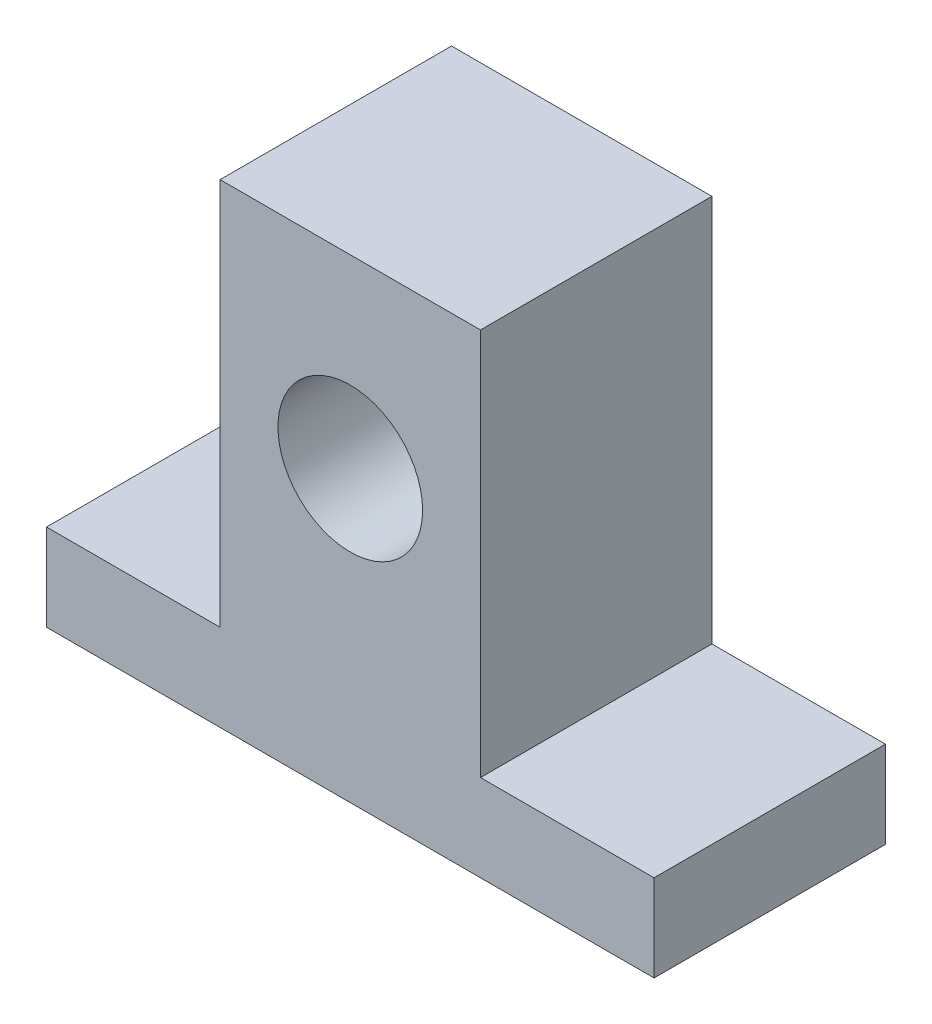
ISO-10303-21;
HEADER;
FILE_DESCRIPTION(('STEP AP214'),'2;1');
FILE_NAME('part.step','',(''),(''),'','','');
FILE_SCHEMA(('AUTOMOTIVE_DESIGN { 1 0 10303 214 1 1 1 1 }'));
ENDSEC;
DATA;
#1=APPLICATION_CONTEXT('core data for automotive mechanical design processes');
#2=APPLICATION_PROTOCOL_DEFINITION('international standard','automotive_design',2000,#1);
#3=PRODUCT_CONTEXT('',#1,'mechanical');
#4=PRODUCT('Part','Part','',(#3));
#5=PRODUCT_RELATED_PRODUCT_CATEGORY('part','',(#4));
#6=PRODUCT_DEFINITION_FORMATION('','',#4);
#7=PRODUCT_DEFINITION_CONTEXT('part definition',#1,'design');
#8=PRODUCT_DEFINITION('design','',#6,#7);
#9=PRODUCT_DEFINITION_SHAPE('','',#8);
#10=(LENGTH_UNIT() NAMED_UNIT(*) SI_UNIT(.MILLI.,.METRE.));
#11=(NAMED_UNIT(*) PLANE_ANGLE_UNIT() SI_UNIT($,.RADIAN.));
#12=(NAMED_UNIT(*) SI_UNIT($,.STERADIAN.) SOLID_ANGLE_UNIT());
#13=UNCERTAINTY_MEASURE_WITH_UNIT(LENGTH_MEASURE(1.E-05),#10,'distance_accuracy_value','');
#14=(GEOMETRIC_REPRESENTATION_CONTEXT(3) GLOBAL_UNCERTAINTY_ASSIGNED_CONTEXT((#13)) GLOBAL_UNIT_ASSIGNED_CONTEXT((#10,
#11,#12)) REPRESENTATION_CONTEXT('',''));
#15=CARTESIAN_POINT('',(0.,0.,0.));
#16=DIRECTION('',(0.,0.,1.));
#17=DIRECTION('',(1.,0.,0.));
#18=AXIS2_PLACEMENT_3D('',#15,#16,#17);
#19=CARTESIAN_POINT('',(0.,0.,16.));
#20=DIRECTION('',(0.,0.,-1.));
#21=DIRECTION('',(-1.,0.,0.));
#22=AXIS2_PLACEMENT_3D('',#19,#20,#21);
#23=PLANE('',#22);
#24=DIRECTION('',(0.,-1.,0.));
#25=VECTOR('',#24,1.);
#26=CARTESIAN_POINT('',(-9.00000000000001,32.8,16.));
#27=LINE('',#26,#25);
#28=CARTESIAN_POINT('',(-9.00000000000001,32.8,16.));
#29=VERTEX_POINT('',#28);
#30=CARTESIAN_POINT('',(-9.,6.,16.));
#31=VERTEX_POINT('',#30);
#32=EDGE_CURVE('E144',#29,#31,#27,.T.);
#33=ORIENTED_EDGE('',*,*,#32,.T.);
#34=DIRECTION('',(-1.,0.,0.));
#35=VECTOR('',#34,1.);
#36=CARTESIAN_POINT('',(-9.,6.,16.));
#37=LINE('',#36,#35);
#38=CARTESIAN_POINT('',(-21.,6.,16.));
#39=VERTEX_POINT('',#38);
#40=EDGE_CURVE('E92',#31,#39,#37,.T.);
#41=ORIENTED_EDGE('',*,*,#40,.T.);
#42=DIRECTION('',(0.,-1.,0.));
#43=VECTOR('',#42,1.);
#44=CARTESIAN_POINT('',(-21.,6.,16.));
#45=LINE('',#44,#43);
#46=CARTESIAN_POINT('',(-21.,0.,16.));
#47=VERTEX_POINT('',#46);
#48=EDGE_CURVE('E159',#39,#47,#45,.T.);
#49=ORIENTED_EDGE('',*,*,#48,.T.);
#50=DIRECTION('',(1.,0.,0.));
#51=VECTOR('',#50,1.);
#52=CARTESIAN_POINT('',(-21.,0.,16.));
#53=LINE('',#52,#51);
#54=CARTESIAN_POINT('',(21.,0.,16.));
#55=VERTEX_POINT('',#54);
#56=EDGE_CURVE('E172',#47,#55,#53,.T.);
#57=ORIENTED_EDGE('',*,*,#56,.T.);
#58=DIRECTION('',(0.,1.,0.));
#59=VECTOR('',#58,1.);
#60=CARTESIAN_POINT('',(21.,6.,16.));
#61=LINE('',#60,#59);
#62=CARTESIAN_POINT('',(21.,6.,16.));
#63=VERTEX_POINT('',#62);
#64=EDGE_CURVE('E111',#55,#63,#61,.T.);
#65=ORIENTED_EDGE('',*,*,#64,.T.);
#66=DIRECTION('',(-1.,0.,0.));
#67=VECTOR('',#66,1.);
#68=CARTESIAN_POINT('',(9.,6.,16.));
#69=LINE('',#68,#67);
#70=CARTESIAN_POINT('',(9.,6.,16.));
#71=VERTEX_POINT('',#70);
#72=EDGE_CURVE('E105',#63,#71,#69,.T.);
#73=ORIENTED_EDGE('',*,*,#72,.T.);
#74=DIRECTION('',(0.,1.,0.));
#75=VECTOR('',#74,1.);
#76=CARTESIAN_POINT('',(9.00000000000001,32.8,16.));
#77=LINE('',#76,#75);
#78=CARTESIAN_POINT('',(9.00000000000001,32.8,16.));
#79=VERTEX_POINT('',#78);
#80=EDGE_CURVE('E109',#71,#79,#77,.T.);
#81=ORIENTED_EDGE('',*,*,#80,.T.);
#82=DIRECTION('',(-1.,0.,0.));
#83=VECTOR('',#82,1.);
#84=CARTESIAN_POINT('',(9.00000000000001,32.8,16.));
#85=LINE('',#84,#83);
#86=EDGE_CURVE('E49',#79,#29,#85,.T.);
#87=ORIENTED_EDGE('',*,*,#86,.T.);
#88=EDGE_LOOP('',(#33,#41,#49,#57,#65,#73,#81,#87));
#89=FACE_BOUND('',#88,.T.);
#90=CARTESIAN_POINT('',(0.,20.,16.));
#91=DIRECTION('',(0.,0.,1.));
#92=DIRECTION('',(1.,0.,0.));
#93=AXIS2_PLACEMENT_3D('',#90,#91,#92);
#94=CIRCLE('',#93,5.);
#95=CARTESIAN_POINT('',(5.,20.,16.));
#96=VERTEX_POINT('',#95);
#97=EDGE_CURVE('E133',#96,#96,#94,.T.);
#98=ORIENTED_EDGE('',*,*,#97,.F.);
#99=EDGE_LOOP('',(#98));
#100=FACE_BOUND('',#99,.T.);
#101=ADVANCED_FACE('F32',(#89,#100),#23,.F.);
#102=CARTESIAN_POINT('',(0.,0.,0.));
#103=DIRECTION('',(0.,0.,-1.));
#104=DIRECTION('',(-1.,0.,0.));
#105=AXIS2_PLACEMENT_3D('',#102,#103,#104);
#106=PLANE('',#105);
#107=DIRECTION('',(0.,-1.,0.));
#108=VECTOR('',#107,1.);
#109=CARTESIAN_POINT('',(-9.00000000000001,32.8,0.));
#110=LINE('',#109,#108);
#111=CARTESIAN_POINT('',(-9.00000000000001,32.8,0.));
#112=VERTEX_POINT('',#111);
#113=CARTESIAN_POINT('',(-9.,6.,0.));
#114=VERTEX_POINT('',#113);
#115=EDGE_CURVE('E129',#112,#114,#110,.T.);
#116=ORIENTED_EDGE('',*,*,#115,.F.);
#117=DIRECTION('',(-1.,0.,0.));
#118=VECTOR('',#117,1.);
#119=CARTESIAN_POINT('',(9.00000000000001,32.8,0.));
#120=LINE('',#119,#118);
#121=CARTESIAN_POINT('',(9.00000000000001,32.8,0.));
#122=VERTEX_POINT('',#121);
#123=EDGE_CURVE('E84',#122,#112,#120,.T.);
#124=ORIENTED_EDGE('',*,*,#123,.F.);
#125=DIRECTION('',(0.,1.,0.));
#126=VECTOR('',#125,1.);
#127=CARTESIAN_POINT('',(9.00000000000001,32.8,0.));
#128=LINE('',#127,#126);
#129=CARTESIAN_POINT('',(9.,6.,0.));
#130=VERTEX_POINT('',#129);
#131=EDGE_CURVE('E78',#130,#122,#128,.T.);
#132=ORIENTED_EDGE('',*,*,#131,.F.);
#133=DIRECTION('',(-1.,0.,0.));
#134=VECTOR('',#133,1.);
#135=CARTESIAN_POINT('',(9.,6.,0.));
#136=LINE('',#135,#134);
#137=CARTESIAN_POINT('',(21.,6.,0.));
#138=VERTEX_POINT('',#137);
#139=EDGE_CURVE('E119',#138,#130,#136,.T.);
#140=ORIENTED_EDGE('',*,*,#139,.F.);
#141=DIRECTION('',(0.,1.,0.));
#142=VECTOR('',#141,1.);
#143=CARTESIAN_POINT('',(21.,6.,0.));
#144=LINE('',#143,#142);
#145=CARTESIAN_POINT('',(21.,0.,0.));
#146=VERTEX_POINT('',#145);
#147=EDGE_CURVE('E139',#146,#138,#144,.T.);
#148=ORIENTED_EDGE('',*,*,#147,.F.);
#149=DIRECTION('',(1.,0.,0.));
#150=VECTOR('',#149,1.);
#151=CARTESIAN_POINT('',(-21.,0.,0.));
#152=LINE('',#151,#150);
#153=CARTESIAN_POINT('',(-21.,0.,0.));
#154=VERTEX_POINT('',#153);
#155=EDGE_CURVE('E137',#154,#146,#152,.T.);
#156=ORIENTED_EDGE('',*,*,#155,.F.);
#157=DIRECTION('',(0.,-1.,0.));
#158=VECTOR('',#157,1.);
#159=CARTESIAN_POINT('',(-21.,6.,0.));
#160=LINE('',#159,#158);
#161=CARTESIAN_POINT('',(-21.,6.,0.));
#162=VERTEX_POINT('',#161);
#163=EDGE_CURVE('E135',#162,#154,#160,.T.);
#164=ORIENTED_EDGE('',*,*,#163,.F.);
#165=DIRECTION('',(-1.,0.,0.));
#166=VECTOR('',#165,1.);
#167=CARTESIAN_POINT('',(-9.,6.,0.));
#168=LINE('',#167,#166);
#169=EDGE_CURVE('E132',#114,#162,#168,.T.);
#170=ORIENTED_EDGE('',*,*,#169,.F.);
#171=EDGE_LOOP('',(#116,#124,#132,#140,#148,#156,#164,#170));
#172=FACE_BOUND('',#171,.T.);
#173=CARTESIAN_POINT('',(0.,20.,0.));
#174=DIRECTION('',(0.,0.,1.));
#175=DIRECTION('',(1.,0.,0.));
#176=AXIS2_PLACEMENT_3D('',#173,#174,#175);
#177=CIRCLE('',#176,5.);
#178=CARTESIAN_POINT('',(5.,20.,0.));
#179=VERTEX_POINT('',#178);
#180=EDGE_CURVE('E178',#179,#179,#177,.T.);
#181=ORIENTED_EDGE('',*,*,#180,.T.);
#182=EDGE_LOOP('',(#181));
#183=FACE_BOUND('',#182,.T.);
#184=ADVANCED_FACE('F163',(#172,#183),#106,.T.);
#185=CARTESIAN_POINT('',(-9.00000000000001,32.8,16.));
#186=DIRECTION('',(1.,0.,0.));
#187=DIRECTION('',(0.,1.,0.));
#188=AXIS2_PLACEMENT_3D('',#185,#186,#187);
#189=PLANE('',#188);
#190=ORIENTED_EDGE('',*,*,#115,.T.);
#191=DIRECTION('',(0.,0.,-1.));
#192=VECTOR('',#191,1.);
#193=CARTESIAN_POINT('',(-9.,6.,16.));
#194=LINE('',#193,#192);
#195=EDGE_CURVE('E11',#31,#114,#194,.T.);
#196=ORIENTED_EDGE('',*,*,#195,.F.);
#197=ORIENTED_EDGE('',*,*,#32,.F.);
#198=DIRECTION('',(0.,0.,-1.));
#199=VECTOR('',#198,1.);
#200=CARTESIAN_POINT('',(-9.00000000000001,32.8,16.));
#201=LINE('',#200,#199);
#202=EDGE_CURVE('E125',#29,#112,#201,.T.);
#203=ORIENTED_EDGE('',*,*,#202,.T.);
#204=EDGE_LOOP('',(#190,#196,#197,#203));
#205=FACE_BOUND('',#204,.T.);
#206=ADVANCED_FACE('F34',(#205),#189,.F.);
#207=CARTESIAN_POINT('',(-9.,6.,16.));
#208=DIRECTION('',(0.,-1.,0.));
#209=DIRECTION('',(1.,0.,0.));
#210=AXIS2_PLACEMENT_3D('',#207,#208,#209);
#211=PLANE('',#210);
#212=ORIENTED_EDGE('',*,*,#169,.T.);
#213=DIRECTION('',(0.,0.,-1.));
#214=VECTOR('',#213,1.);
#215=CARTESIAN_POINT('',(-21.,6.,16.));
#216=LINE('',#215,#214);
#217=EDGE_CURVE('E41',#39,#162,#216,.T.);
#218=ORIENTED_EDGE('',*,*,#217,.F.);
#219=ORIENTED_EDGE('',*,*,#40,.F.);
#220=ORIENTED_EDGE('',*,*,#195,.T.);
#221=EDGE_LOOP('',(#212,#218,#219,#220));
#222=FACE_BOUND('',#221,.T.);
#223=ADVANCED_FACE('F206',(#222),#211,.F.);
#224=CARTESIAN_POINT('',(-21.,6.,16.));
#225=DIRECTION('',(1.,0.,0.));
#226=DIRECTION('',(0.,0.,-1.));
#227=AXIS2_PLACEMENT_3D('',#224,#225,#226);
#228=PLANE('',#227);
#229=ORIENTED_EDGE('',*,*,#163,.T.);
#230=DIRECTION('',(0.,0.,-1.));
#231=VECTOR('',#230,1.);
#232=CARTESIAN_POINT('',(-21.,0.,16.));
#233=LINE('',#232,#231);
#234=EDGE_CURVE('E151',#47,#154,#233,.T.);
#235=ORIENTED_EDGE('',*,*,#234,.F.);
#236=ORIENTED_EDGE('',*,*,#48,.F.);
#237=ORIENTED_EDGE('',*,*,#217,.T.);
#238=EDGE_LOOP('',(#229,#235,#236,#237));
#239=FACE_BOUND('',#238,.T.);
#240=ADVANCED_FACE('F157',(#239),#228,.F.);
#241=CARTESIAN_POINT('',(-21.,0.,16.));
#242=DIRECTION('',(0.,1.,0.));
#243=DIRECTION('',(0.,0.,1.));
#244=AXIS2_PLACEMENT_3D('',#241,#242,#243);
#245=PLANE('',#244);
#246=ORIENTED_EDGE('',*,*,#155,.T.);
#247=DIRECTION('',(0.,0.,-1.));
#248=VECTOR('',#247,1.);
#249=CARTESIAN_POINT('',(21.,0.,16.));
#250=LINE('',#249,#248);
#251=EDGE_CURVE('E148',#55,#146,#250,.T.);
#252=ORIENTED_EDGE('',*,*,#251,.F.);
#253=ORIENTED_EDGE('',*,*,#56,.F.);
#254=ORIENTED_EDGE('',*,*,#234,.T.);
#255=EDGE_LOOP('',(#246,#252,#253,#254));
#256=FACE_BOUND('',#255,.T.);
#257=ADVANCED_FACE('F168',(#256),#245,.F.);
#258=CARTESIAN_POINT('',(21.,6.,16.));
#259=DIRECTION('',(-1.,0.,0.));
#260=DIRECTION('',(0.,0.,1.));
#261=AXIS2_PLACEMENT_3D('',#258,#259,#260);
#262=PLANE('',#261);
#263=ORIENTED_EDGE('',*,*,#147,.T.);
#264=DIRECTION('',(0.,0.,-1.));
#265=VECTOR('',#264,1.);
#266=CARTESIAN_POINT('',(21.,6.,16.));
#267=LINE('',#266,#265);
#268=EDGE_CURVE('E120',#63,#138,#267,.T.);
#269=ORIENTED_EDGE('',*,*,#268,.F.);
#270=ORIENTED_EDGE('',*,*,#64,.F.);
#271=ORIENTED_EDGE('',*,*,#251,.T.);
#272=EDGE_LOOP('',(#263,#269,#270,#271));
#273=FACE_BOUND('',#272,.T.);
#274=ADVANCED_FACE('F171',(#273),#262,.F.);
#275=CARTESIAN_POINT('',(9.,6.,16.));
#276=DIRECTION('',(0.,-1.,0.));
#277=DIRECTION('',(1.,0.,0.));
#278=AXIS2_PLACEMENT_3D('',#275,#276,#277);
#279=PLANE('',#278);
#280=ORIENTED_EDGE('',*,*,#139,.T.);
#281=DIRECTION('',(0.,0.,-1.));
#282=VECTOR('',#281,1.);
#283=CARTESIAN_POINT('',(9.,6.,16.));
#284=LINE('',#283,#282);
#285=EDGE_CURVE('E116',#71,#130,#284,.T.);
#286=ORIENTED_EDGE('',*,*,#285,.F.);
#287=ORIENTED_EDGE('',*,*,#72,.F.);
#288=ORIENTED_EDGE('',*,*,#268,.T.);
#289=EDGE_LOOP('',(#280,#286,#287,#288));
#290=FACE_BOUND('',#289,.T.);
#291=ADVANCED_FACE('F117',(#290),#279,.F.);
#292=CARTESIAN_POINT('',(9.00000000000001,32.8,16.));
#293=DIRECTION('',(-1.,0.,0.));
#294=DIRECTION('',(0.,-1.,0.));
#295=AXIS2_PLACEMENT_3D('',#292,#293,#294);
#296=PLANE('',#295);
#297=ORIENTED_EDGE('',*,*,#131,.T.);
#298=DIRECTION('',(0.,0.,-1.));
#299=VECTOR('',#298,1.);
#300=CARTESIAN_POINT('',(9.00000000000001,32.8,16.));
#301=LINE('',#300,#299);
#302=EDGE_CURVE('E121',#79,#122,#301,.T.);
#303=ORIENTED_EDGE('',*,*,#302,.F.);
#304=ORIENTED_EDGE('',*,*,#80,.F.);
#305=ORIENTED_EDGE('',*,*,#285,.T.);
#306=EDGE_LOOP('',(#297,#303,#304,#305));
#307=FACE_BOUND('',#306,.T.);
#308=ADVANCED_FACE('F123',(#307),#296,.F.);
#309=CARTESIAN_POINT('',(9.00000000000001,32.8,16.));
#310=DIRECTION('',(0.,-1.,0.));
#311=DIRECTION('',(0.,0.,-1.));
#312=AXIS2_PLACEMENT_3D('',#309,#310,#311);
#313=PLANE('',#312);
#314=ORIENTED_EDGE('',*,*,#123,.T.);
#315=ORIENTED_EDGE('',*,*,#202,.F.);
#316=ORIENTED_EDGE('',*,*,#86,.F.);
#317=ORIENTED_EDGE('',*,*,#302,.T.);
#318=EDGE_LOOP('',(#314,#315,#316,#317));
#319=FACE_BOUND('',#318,.T.);
#320=ADVANCED_FACE('F194',(#319),#313,.F.);
#321=CARTESIAN_POINT('',(0.,20.,16.));
#322=DIRECTION('',(0.,0.,-1.));
#323=DIRECTION('',(-1.,0.,0.));
#324=AXIS2_PLACEMENT_3D('',#321,#322,#323);
#325=CYLINDRICAL_SURFACE('',#324,5.);
#326=ORIENTED_EDGE('',*,*,#97,.T.);
#327=EDGE_LOOP('',(#326));
#328=FACE_BOUND('',#327,.T.);
#329=ORIENTED_EDGE('',*,*,#180,.F.);
#330=EDGE_LOOP('',(#329));
#331=FACE_BOUND('',#330,.T.);
#332=ADVANCED_FACE('F184',(#328,#331),#325,.F.);
#333=CLOSED_SHELL('',(#101,#184,#206,#223,#240,#257,#274,#291,#308,#320,#332));
#334=MANIFOLD_SOLID_BREP('B2',#333);
#335=ADVANCED_BREP_SHAPE_REPRESENTATION('',(#18,#334),#14);
#336=SHAPE_DEFINITION_REPRESENTATION(#9,#335);
ENDSEC;
END-ISO-10303-21;
